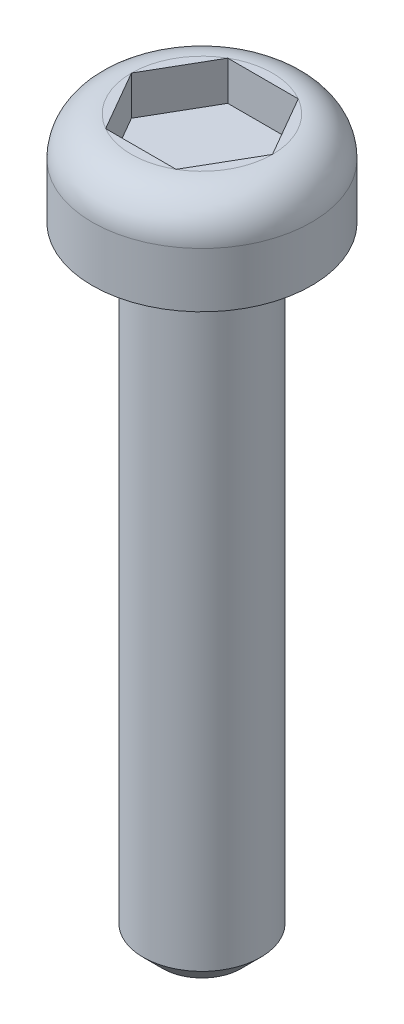
ISO-10303-21;
HEADER;
FILE_DESCRIPTION(('STEP AP214'),'2;1');
FILE_NAME('part.step','',(''),(''),'','','');
FILE_SCHEMA(('AUTOMOTIVE_DESIGN { 1 0 10303 214 1 1 1 1 }'));
ENDSEC;
DATA;
#1=APPLICATION_CONTEXT('core data for automotive mechanical design processes');
#2=APPLICATION_PROTOCOL_DEFINITION('international standard','automotive_design',2000,#1);
#3=PRODUCT_CONTEXT('',#1,'mechanical');
#4=PRODUCT('Part','Part','',(#3));
#5=PRODUCT_RELATED_PRODUCT_CATEGORY('part','',(#4));
#6=PRODUCT_DEFINITION_FORMATION('','',#4);
#7=PRODUCT_DEFINITION_CONTEXT('part definition',#1,'design');
#8=PRODUCT_DEFINITION('design','',#6,#7);
#9=PRODUCT_DEFINITION_SHAPE('','',#8);
#10=(LENGTH_UNIT() NAMED_UNIT(*) SI_UNIT(.MILLI.,.METRE.));
#11=(NAMED_UNIT(*) PLANE_ANGLE_UNIT() SI_UNIT($,.RADIAN.));
#12=(NAMED_UNIT(*) SI_UNIT($,.STERADIAN.) SOLID_ANGLE_UNIT());
#13=UNCERTAINTY_MEASURE_WITH_UNIT(LENGTH_MEASURE(1.E-05),#10,'distance_accuracy_value','');
#14=(GEOMETRIC_REPRESENTATION_CONTEXT(3) GLOBAL_UNCERTAINTY_ASSIGNED_CONTEXT((#13)) GLOBAL_UNIT_ASSIGNED_CONTEXT((#10,
#11,#12)) REPRESENTATION_CONTEXT('',''));
#15=CARTESIAN_POINT('',(0.,0.,0.));
#16=DIRECTION('',(0.,0.,1.));
#17=DIRECTION('',(1.,0.,0.));
#18=AXIS2_PLACEMENT_3D('',#15,#16,#17);
#19=CARTESIAN_POINT('',(0.,18.4,0.));
#20=DIRECTION('',(0.,1.,0.));
#21=DIRECTION('',(0.,0.,1.));
#22=AXIS2_PLACEMENT_3D('',#19,#20,#21);
#23=PLANE('',#22);
#24=DIRECTION('',(0.5,0.,-0.866025403784439));
#25=VECTOR('',#24,1.);
#26=CARTESIAN_POINT('',(0.899999999999998,18.4,1.55884572681199));
#27=LINE('',#26,#25);
#28=CARTESIAN_POINT('',(0.899999999999998,18.4,1.55884572681199));
#29=VERTEX_POINT('',#28);
#30=CARTESIAN_POINT('',(1.8,18.4,0.));
#31=VERTEX_POINT('',#30);
#32=EDGE_CURVE('E51',#29,#31,#27,.T.);
#33=ORIENTED_EDGE('',*,*,#32,.F.);
#34=CARTESIAN_POINT('',(0.,18.4,0.));
#35=DIRECTION('',(0.,1.,0.));
#36=DIRECTION('',(0.,0.,1.));
#37=AXIS2_PLACEMENT_3D('',#34,#35,#36);
#38=CIRCLE('',#37,1.8);
#39=EDGE_CURVE('E150',#29,#31,#38,.T.);
#40=ORIENTED_EDGE('',*,*,#39,.T.);
#41=EDGE_LOOP('',(#33,#40));
#42=FACE_BOUND('',#41,.T.);
#43=ADVANCED_FACE('F36',(#42),#23,.T.);
#44=DIRECTION('',(1.,0.,0.));
#45=VECTOR('',#44,1.);
#46=CARTESIAN_POINT('',(-0.899999999999998,18.4,1.55884572681199));
#47=LINE('',#46,#45);
#48=CARTESIAN_POINT('',(-0.899999999999998,18.4,1.55884572681199));
#49=VERTEX_POINT('',#48);
#50=EDGE_CURVE('E134',#49,#29,#47,.T.);
#51=ORIENTED_EDGE('',*,*,#50,.F.);
#52=EDGE_CURVE('E149',#49,#29,#38,.T.);
#53=ORIENTED_EDGE('',*,*,#52,.T.);
#54=EDGE_LOOP('',(#51,#53));
#55=FACE_BOUND('',#54,.T.);
#56=ADVANCED_FACE('F171',(#55),#23,.T.);
#57=DIRECTION('',(0.5,0.,0.866025403784439));
#58=VECTOR('',#57,1.);
#59=CARTESIAN_POINT('',(-1.8,18.4,0.));
#60=LINE('',#59,#58);
#61=CARTESIAN_POINT('',(-1.8,18.4,0.));
#62=VERTEX_POINT('',#61);
#63=EDGE_CURVE('E132',#62,#49,#60,.T.);
#64=ORIENTED_EDGE('',*,*,#63,.F.);
#65=EDGE_CURVE('E313',#62,#49,#38,.T.);
#66=ORIENTED_EDGE('',*,*,#65,.T.);
#67=EDGE_LOOP('',(#64,#66));
#68=FACE_BOUND('',#67,.T.);
#69=ADVANCED_FACE('F178',(#68),#23,.T.);
#70=DIRECTION('',(-0.5,0.,0.866025403784439));
#71=VECTOR('',#70,1.);
#72=CARTESIAN_POINT('',(-0.899999999999998,18.4,-1.55884572681199));
#73=LINE('',#72,#71);
#74=CARTESIAN_POINT('',(-0.899999999999998,18.4,-1.55884572681199));
#75=VERTEX_POINT('',#74);
#76=EDGE_CURVE('E99',#75,#62,#73,.T.);
#77=ORIENTED_EDGE('',*,*,#76,.F.);
#78=EDGE_CURVE('E218',#75,#62,#38,.T.);
#79=ORIENTED_EDGE('',*,*,#78,.T.);
#80=EDGE_LOOP('',(#77,#79));
#81=FACE_BOUND('',#80,.T.);
#82=ADVANCED_FACE('F198',(#81),#23,.T.);
#83=DIRECTION('',(-1.,0.,0.));
#84=VECTOR('',#83,1.);
#85=CARTESIAN_POINT('',(0.899999999999998,18.4,-1.55884572681199));
#86=LINE('',#85,#84);
#87=CARTESIAN_POINT('',(0.899999999999998,18.4,-1.55884572681199));
#88=VERTEX_POINT('',#87);
#89=EDGE_CURVE('E128',#88,#75,#86,.T.);
#90=ORIENTED_EDGE('',*,*,#89,.F.);
#91=EDGE_CURVE('E209',#88,#75,#38,.T.);
#92=ORIENTED_EDGE('',*,*,#91,.T.);
#93=EDGE_LOOP('',(#90,#92));
#94=FACE_BOUND('',#93,.T.);
#95=ADVANCED_FACE('F186',(#94),#23,.T.);
#96=CARTESIAN_POINT('',(0.,16.,0.));
#97=DIRECTION('',(0.,-1.,0.));
#98=DIRECTION('',(0.,0.,-1.));
#99=AXIS2_PLACEMENT_3D('',#96,#97,#98);
#100=CYLINDRICAL_SURFACE('',#99,1.5);
#101=CARTESIAN_POINT('',(0.,0.5,0.));
#102=DIRECTION('',(0.,1.,0.));
#103=DIRECTION('',(0.,0.,1.));
#104=AXIS2_PLACEMENT_3D('',#101,#102,#103);
#105=CIRCLE('',#104,1.5);
#106=CARTESIAN_POINT('',(0.,0.5,1.5));
#107=VERTEX_POINT('',#106);
#108=EDGE_CURVE('E44',#107,#107,#105,.T.);
#109=ORIENTED_EDGE('',*,*,#108,.T.);
#110=EDGE_LOOP('',(#109));
#111=FACE_BOUND('',#110,.T.);
#112=CARTESIAN_POINT('',(0.,16.,0.));
#113=DIRECTION('',(0.,1.,0.));
#114=DIRECTION('',(0.,0.,1.));
#115=AXIS2_PLACEMENT_3D('',#112,#113,#114);
#116=CIRCLE('',#115,1.5);
#117=CARTESIAN_POINT('',(0.,16.,1.5));
#118=VERTEX_POINT('',#117);
#119=EDGE_CURVE('E146',#118,#118,#116,.T.);
#120=ORIENTED_EDGE('',*,*,#119,.F.);
#121=EDGE_LOOP('',(#120));
#122=FACE_BOUND('',#121,.T.);
#123=ADVANCED_FACE('F159',(#111,#122),#100,.T.);
#124=CARTESIAN_POINT('',(0.,0.,0.));
#125=DIRECTION('',(0.,1.,0.));
#126=DIRECTION('',(0.,0.,1.));
#127=AXIS2_PLACEMENT_3D('',#124,#125,#126);
#128=PLANE('',#127);
#129=CARTESIAN_POINT('',(0.,0.,0.));
#130=DIRECTION('',(0.,1.,0.));
#131=DIRECTION('',(0.,0.,1.));
#132=AXIS2_PLACEMENT_3D('',#129,#130,#131);
#133=CIRCLE('',#132,0.999999999999999);
#134=CARTESIAN_POINT('',(0.,0.,0.999999999999999));
#135=VERTEX_POINT('',#134);
#136=EDGE_CURVE('E11',#135,#135,#133,.F.);
#137=ORIENTED_EDGE('',*,*,#136,.T.);
#138=EDGE_LOOP('',(#137));
#139=FACE_BOUND('',#138,.T.);
#140=ADVANCED_FACE('F193',(#139),#128,.F.);
#141=CARTESIAN_POINT('',(0.,18.4,0.));
#142=DIRECTION('',(0.,-1.,0.));
#143=DIRECTION('',(0.,0.,-1.));
#144=AXIS2_PLACEMENT_3D('',#141,#142,#143);
#145=CYLINDRICAL_SURFACE('',#144,2.8);
#146=CARTESIAN_POINT('',(0.,17.4,0.));
#147=DIRECTION('',(0.,1.,0.));
#148=DIRECTION('',(0.,0.,1.));
#149=AXIS2_PLACEMENT_3D('',#146,#147,#148);
#150=CIRCLE('',#149,2.8);
#151=CARTESIAN_POINT('',(0.,17.4,2.8));
#152=VERTEX_POINT('',#151);
#153=EDGE_CURVE('E153',#152,#152,#150,.F.);
#154=ORIENTED_EDGE('',*,*,#153,.T.);
#155=EDGE_LOOP('',(#154));
#156=FACE_BOUND('',#155,.T.);
#157=CARTESIAN_POINT('',(0.,16.,0.));
#158=DIRECTION('',(0.,1.,0.));
#159=DIRECTION('',(0.,0.,1.));
#160=AXIS2_PLACEMENT_3D('',#157,#158,#159);
#161=CIRCLE('',#160,2.8);
#162=CARTESIAN_POINT('',(0.,16.,2.8));
#163=VERTEX_POINT('',#162);
#164=EDGE_CURVE('E138',#163,#163,#161,.T.);
#165=ORIENTED_EDGE('',*,*,#164,.T.);
#166=EDGE_LOOP('',(#165));
#167=FACE_BOUND('',#166,.T.);
#168=ADVANCED_FACE('F184',(#156,#167),#145,.T.);
#169=DIRECTION('',(-0.5,0.,-0.866025403784438));
#170=VECTOR('',#169,1.);
#171=CARTESIAN_POINT('',(1.8,18.4,0.));
#172=LINE('',#171,#170);
#173=EDGE_CURVE('E125',#31,#88,#172,.T.);
#174=ORIENTED_EDGE('',*,*,#173,.F.);
#175=EDGE_CURVE('E154',#31,#88,#38,.T.);
#176=ORIENTED_EDGE('',*,*,#175,.T.);
#177=EDGE_LOOP('',(#174,#176));
#178=FACE_BOUND('',#177,.T.);
#179=ADVANCED_FACE('F174',(#178),#23,.T.);
#180=CARTESIAN_POINT('',(0.,16.,0.));
#181=DIRECTION('',(0.,1.,0.));
#182=DIRECTION('',(0.,0.,1.));
#183=AXIS2_PLACEMENT_3D('',#180,#181,#182);
#184=PLANE('',#183);
#185=ORIENTED_EDGE('',*,*,#119,.T.);
#186=EDGE_LOOP('',(#185));
#187=FACE_BOUND('',#186,.T.);
#188=ORIENTED_EDGE('',*,*,#164,.F.);
#189=EDGE_LOOP('',(#188));
#190=FACE_BOUND('',#189,.T.);
#191=ADVANCED_FACE('F183',(#187,#190),#184,.F.);
#192=CARTESIAN_POINT('',(0.,17.4,0.));
#193=DIRECTION('',(0.,1.,0.));
#194=DIRECTION('',(0.,0.,1.));
#195=AXIS2_PLACEMENT_3D('',#192,#193,#194);
#196=TOROIDAL_SURFACE('',#195,1.8,1.);
#197=ORIENTED_EDGE('',*,*,#153,.F.);
#198=EDGE_LOOP('',(#197));
#199=FACE_BOUND('',#198,.T.);
#200=ORIENTED_EDGE('',*,*,#39,.F.);
#201=ORIENTED_EDGE('',*,*,#52,.F.);
#202=ORIENTED_EDGE('',*,*,#65,.F.);
#203=ORIENTED_EDGE('',*,*,#78,.F.);
#204=ORIENTED_EDGE('',*,*,#91,.F.);
#205=ORIENTED_EDGE('',*,*,#175,.F.);
#206=EDGE_LOOP('',(#200,#201,#202,#203,#204,#205));
#207=FACE_BOUND('',#206,.T.);
#208=ADVANCED_FACE('F191',(#199,#207),#196,.T.);
#209=CARTESIAN_POINT('',(0.899999999999998,17.4,1.55884572681199));
#210=DIRECTION('',(0.866025403784439,0.,0.5));
#211=DIRECTION('',(0.5,0.,-0.866025403784439));
#212=AXIS2_PLACEMENT_3D('',#209,#210,#211);
#213=PLANE('',#212);
#214=ORIENTED_EDGE('',*,*,#32,.T.);
#215=DIRECTION('',(0.,1.,0.));
#216=VECTOR('',#215,1.);
#217=CARTESIAN_POINT('',(1.8,17.4,0.));
#218=LINE('',#217,#216);
#219=CARTESIAN_POINT('',(1.8,17.4,0.));
#220=VERTEX_POINT('',#219);
#221=EDGE_CURVE('E81',#220,#31,#218,.T.);
#222=ORIENTED_EDGE('',*,*,#221,.F.);
#223=DIRECTION('',(0.5,0.,-0.866025403784439));
#224=VECTOR('',#223,1.);
#225=CARTESIAN_POINT('',(0.899999999999998,17.4,1.55884572681199));
#226=LINE('',#225,#224);
#227=CARTESIAN_POINT('',(0.899999999999998,17.4,1.55884572681199));
#228=VERTEX_POINT('',#227);
#229=EDGE_CURVE('E136',#228,#220,#226,.T.);
#230=ORIENTED_EDGE('',*,*,#229,.F.);
#231=DIRECTION('',(0.,1.,0.));
#232=VECTOR('',#231,1.);
#233=CARTESIAN_POINT('',(0.899999999999998,17.4,1.55884572681199));
#234=LINE('',#233,#232);
#235=EDGE_CURVE('E59',#228,#29,#234,.T.);
#236=ORIENTED_EDGE('',*,*,#235,.T.);
#237=EDGE_LOOP('',(#214,#222,#230,#236));
#238=FACE_BOUND('',#237,.T.);
#239=ADVANCED_FACE('F221',(#238),#213,.F.);
#240=CARTESIAN_POINT('',(-0.899999999999998,17.4,1.55884572681199));
#241=DIRECTION('',(0.,0.,1.));
#242=DIRECTION('',(1.,0.,0.));
#243=AXIS2_PLACEMENT_3D('',#240,#241,#242);
#244=PLANE('',#243);
#245=ORIENTED_EDGE('',*,*,#50,.T.);
#246=ORIENTED_EDGE('',*,*,#235,.F.);
#247=DIRECTION('',(1.,0.,0.));
#248=VECTOR('',#247,1.);
#249=CARTESIAN_POINT('',(-0.899999999999998,17.4,1.55884572681199));
#250=LINE('',#249,#248);
#251=CARTESIAN_POINT('',(-0.899999999999998,17.4,1.55884572681199));
#252=VERTEX_POINT('',#251);
#253=EDGE_CURVE('E111',#252,#228,#250,.T.);
#254=ORIENTED_EDGE('',*,*,#253,.F.);
#255=DIRECTION('',(0.,1.,0.));
#256=VECTOR('',#255,1.);
#257=CARTESIAN_POINT('',(-0.899999999999998,17.4,1.55884572681199));
#258=LINE('',#257,#256);
#259=EDGE_CURVE('E103',#252,#49,#258,.T.);
#260=ORIENTED_EDGE('',*,*,#259,.T.);
#261=EDGE_LOOP('',(#245,#246,#254,#260));
#262=FACE_BOUND('',#261,.T.);
#263=ADVANCED_FACE('F223',(#262),#244,.F.);
#264=CARTESIAN_POINT('',(-1.8,17.4,0.));
#265=DIRECTION('',(-0.866025403784439,0.,0.5));
#266=DIRECTION('',(0.5,0.,0.866025403784439));
#267=AXIS2_PLACEMENT_3D('',#264,#265,#266);
#268=PLANE('',#267);
#269=ORIENTED_EDGE('',*,*,#63,.T.);
#270=ORIENTED_EDGE('',*,*,#259,.F.);
#271=DIRECTION('',(0.5,0.,0.866025403784439));
#272=VECTOR('',#271,1.);
#273=CARTESIAN_POINT('',(-1.8,17.4,0.));
#274=LINE('',#273,#272);
#275=CARTESIAN_POINT('',(-1.8,17.4,0.));
#276=VERTEX_POINT('',#275);
#277=EDGE_CURVE('E107',#276,#252,#274,.T.);
#278=ORIENTED_EDGE('',*,*,#277,.F.);
#279=DIRECTION('',(0.,1.,0.));
#280=VECTOR('',#279,1.);
#281=CARTESIAN_POINT('',(-1.8,17.4,0.));
#282=LINE('',#281,#280);
#283=EDGE_CURVE('E92',#276,#62,#282,.T.);
#284=ORIENTED_EDGE('',*,*,#283,.T.);
#285=EDGE_LOOP('',(#269,#270,#278,#284));
#286=FACE_BOUND('',#285,.T.);
#287=ADVANCED_FACE('F108',(#286),#268,.F.);
#288=CARTESIAN_POINT('',(-0.899999999999998,17.4,-1.55884572681199));
#289=DIRECTION('',(-0.866025403784439,0.,-0.5));
#290=DIRECTION('',(-0.5,0.,0.866025403784439));
#291=AXIS2_PLACEMENT_3D('',#288,#289,#290);
#292=PLANE('',#291);
#293=ORIENTED_EDGE('',*,*,#76,.T.);
#294=ORIENTED_EDGE('',*,*,#283,.F.);
#295=DIRECTION('',(-0.5,0.,0.866025403784439));
#296=VECTOR('',#295,1.);
#297=CARTESIAN_POINT('',(-0.899999999999998,17.4,-1.55884572681199));
#298=LINE('',#297,#296);
#299=CARTESIAN_POINT('',(-0.899999999999998,17.4,-1.55884572681199));
#300=VERTEX_POINT('',#299);
#301=EDGE_CURVE('E96',#300,#276,#298,.T.);
#302=ORIENTED_EDGE('',*,*,#301,.F.);
#303=DIRECTION('',(0.,1.,0.));
#304=VECTOR('',#303,1.);
#305=CARTESIAN_POINT('',(-0.899999999999998,17.4,-1.55884572681199));
#306=LINE('',#305,#304);
#307=EDGE_CURVE('E104',#300,#75,#306,.T.);
#308=ORIENTED_EDGE('',*,*,#307,.T.);
#309=EDGE_LOOP('',(#293,#294,#302,#308));
#310=FACE_BOUND('',#309,.T.);
#311=ADVANCED_FACE('F94',(#310),#292,.F.);
#312=CARTESIAN_POINT('',(0.899999999999998,17.4,-1.55884572681199));
#313=DIRECTION('',(0.,0.,-1.));
#314=DIRECTION('',(-1.,0.,0.));
#315=AXIS2_PLACEMENT_3D('',#312,#313,#314);
#316=PLANE('',#315);
#317=ORIENTED_EDGE('',*,*,#89,.T.);
#318=ORIENTED_EDGE('',*,*,#307,.F.);
#319=DIRECTION('',(-1.,0.,0.));
#320=VECTOR('',#319,1.);
#321=CARTESIAN_POINT('',(0.899999999999998,17.4,-1.55884572681199));
#322=LINE('',#321,#320);
#323=CARTESIAN_POINT('',(0.899999999999998,17.4,-1.55884572681199));
#324=VERTEX_POINT('',#323);
#325=EDGE_CURVE('E117',#324,#300,#322,.T.);
#326=ORIENTED_EDGE('',*,*,#325,.F.);
#327=DIRECTION('',(0.,1.,0.));
#328=VECTOR('',#327,1.);
#329=CARTESIAN_POINT('',(0.899999999999998,17.4,-1.55884572681199));
#330=LINE('',#329,#328);
#331=EDGE_CURVE('E141',#324,#88,#330,.T.);
#332=ORIENTED_EDGE('',*,*,#331,.T.);
#333=EDGE_LOOP('',(#317,#318,#326,#332));
#334=FACE_BOUND('',#333,.T.);
#335=ADVANCED_FACE('F233',(#334),#316,.F.);
#336=CARTESIAN_POINT('',(1.8,17.4,0.));
#337=DIRECTION('',(0.866025403784439,0.,-0.5));
#338=DIRECTION('',(-0.5,0.,-0.866025403784438));
#339=AXIS2_PLACEMENT_3D('',#336,#337,#338);
#340=PLANE('',#339);
#341=ORIENTED_EDGE('',*,*,#173,.T.);
#342=ORIENTED_EDGE('',*,*,#331,.F.);
#343=DIRECTION('',(-0.5,0.,-0.866025403784438));
#344=VECTOR('',#343,1.);
#345=CARTESIAN_POINT('',(1.8,17.4,0.));
#346=LINE('',#345,#344);
#347=EDGE_CURVE('E119',#220,#324,#346,.T.);
#348=ORIENTED_EDGE('',*,*,#347,.F.);
#349=ORIENTED_EDGE('',*,*,#221,.T.);
#350=EDGE_LOOP('',(#341,#342,#348,#349));
#351=FACE_BOUND('',#350,.T.);
#352=ADVANCED_FACE('F167',(#351),#340,.F.);
#353=CARTESIAN_POINT('',(0.,17.4,0.));
#354=DIRECTION('',(0.,1.,0.));
#355=DIRECTION('',(0.,0.,1.));
#356=AXIS2_PLACEMENT_3D('',#353,#354,#355);
#357=PLANE('',#356);
#358=ORIENTED_EDGE('',*,*,#229,.T.);
#359=ORIENTED_EDGE('',*,*,#347,.T.);
#360=ORIENTED_EDGE('',*,*,#325,.T.);
#361=ORIENTED_EDGE('',*,*,#301,.T.);
#362=ORIENTED_EDGE('',*,*,#277,.T.);
#363=ORIENTED_EDGE('',*,*,#253,.T.);
#364=EDGE_LOOP('',(#358,#359,#360,#361,#362,#363));
#365=FACE_BOUND('',#364,.T.);
#366=ADVANCED_FACE('F114',(#365),#357,.T.);
#367=CARTESIAN_POINT('',(0.,0.5,0.));
#368=DIRECTION('',(0.,1.,0.));
#369=DIRECTION('',(0.,0.,1.));
#370=AXIS2_PLACEMENT_3D('',#367,#368,#369);
#371=CONICAL_SURFACE('',#370,1.5,0.785398163397449);
#372=ORIENTED_EDGE('',*,*,#136,.F.);
#373=EDGE_LOOP('',(#372));
#374=FACE_BOUND('',#373,.T.);
#375=ORIENTED_EDGE('',*,*,#108,.F.);
#376=EDGE_LOOP('',(#375));
#377=FACE_BOUND('',#376,.T.);
#378=ADVANCED_FACE('F38',(#374,#377),#371,.T.);
#379=CLOSED_SHELL('',(#43,#56,#69,#82,#95,#123,#140,#168,#179,#191,#208,#239,#263,#287,#311,
#335,#352,#366,#378));
#380=MANIFOLD_SOLID_BREP('B2',#379);
#381=ADVANCED_BREP_SHAPE_REPRESENTATION('',(#18,#380),#14);
#382=SHAPE_DEFINITION_REPRESENTATION(#9,#381);
ENDSEC;
END-ISO-10303-21;
